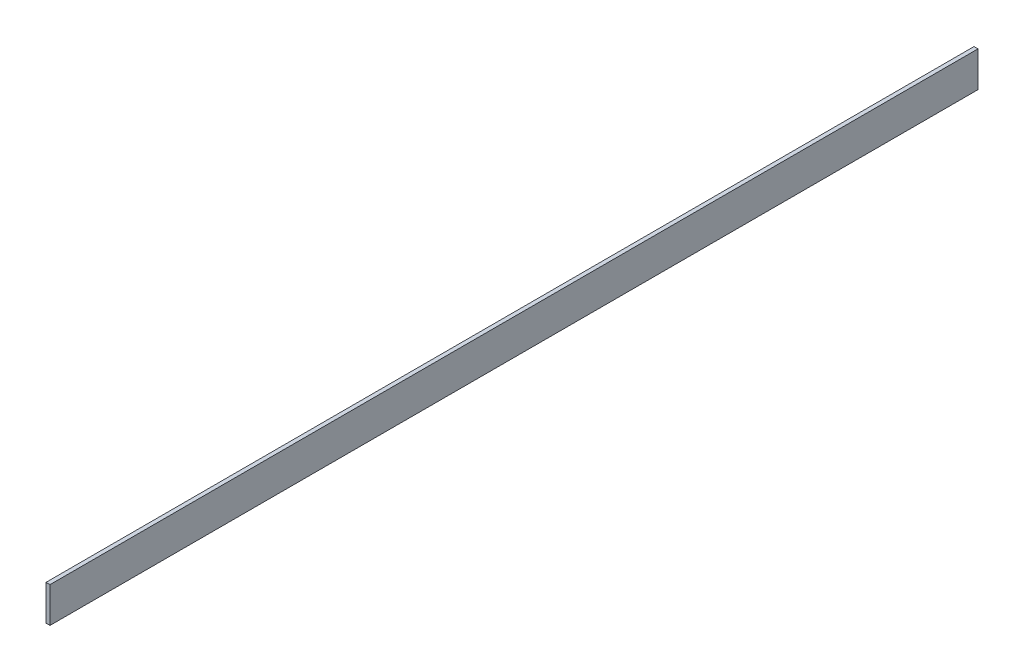
ISO-10303-21;
HEADER;
FILE_DESCRIPTION(('STEP AP214'),'2;1');
FILE_NAME('part.step','',(''),(''),'','','');
FILE_SCHEMA(('AUTOMOTIVE_DESIGN { 1 0 10303 214 1 1 1 1 }'));
ENDSEC;
DATA;
#1=APPLICATION_CONTEXT('core data for automotive mechanical design processes');
#2=APPLICATION_PROTOCOL_DEFINITION('international standard','automotive_design',2000,#1);
#3=PRODUCT_CONTEXT('',#1,'mechanical');
#4=PRODUCT('Part','Part','',(#3));
#5=PRODUCT_RELATED_PRODUCT_CATEGORY('part','',(#4));
#6=PRODUCT_DEFINITION_FORMATION('','',#4);
#7=PRODUCT_DEFINITION_CONTEXT('part definition',#1,'design');
#8=PRODUCT_DEFINITION('design','',#6,#7);
#9=PRODUCT_DEFINITION_SHAPE('','',#8);
#10=(LENGTH_UNIT() NAMED_UNIT(*) SI_UNIT(.MILLI.,.METRE.));
#11=(NAMED_UNIT(*) PLANE_ANGLE_UNIT() SI_UNIT($,.RADIAN.));
#12=(NAMED_UNIT(*) SI_UNIT($,.STERADIAN.) SOLID_ANGLE_UNIT());
#13=UNCERTAINTY_MEASURE_WITH_UNIT(LENGTH_MEASURE(1.E-05),#10,'distance_accuracy_value','');
#14=(GEOMETRIC_REPRESENTATION_CONTEXT(3) GLOBAL_UNCERTAINTY_ASSIGNED_CONTEXT((#13)) GLOBAL_UNIT_ASSIGNED_CONTEXT((#10,
#11,#12)) REPRESENTATION_CONTEXT('',''));
#15=CARTESIAN_POINT('',(0.,0.,0.));
#16=DIRECTION('',(0.,0.,1.));
#17=DIRECTION('',(1.,0.,0.));
#18=AXIS2_PLACEMENT_3D('',#15,#16,#17);
#19=CARTESIAN_POINT('',(-0.900000000000026,8.,-210.000000000001));
#20=DIRECTION('',(0.,0.,-1.));
#21=DIRECTION('',(-1.,0.,0.));
#22=AXIS2_PLACEMENT_3D('',#19,#20,#21);
#23=PLANE('',#22);
#24=DIRECTION('',(1.,0.,0.));
#25=VECTOR('',#24,1.);
#26=CARTESIAN_POINT('',(-0.900000000000026,-8.,-210.000000000001));
#27=LINE('',#26,#25);
#28=CARTESIAN_POINT('',(-0.900000000000026,-8.,-210.000000000001));
#29=VERTEX_POINT('',#28);
#30=CARTESIAN_POINT('',(0.899999999999974,-8.,-210.000000000001));
#31=VERTEX_POINT('',#30);
#32=EDGE_CURVE('E102',#29,#31,#27,.T.);
#33=ORIENTED_EDGE('',*,*,#32,.F.);
#34=DIRECTION('',(0.,-1.,0.));
#35=VECTOR('',#34,1.);
#36=CARTESIAN_POINT('',(-0.900000000000026,8.,-210.000000000001));
#37=LINE('',#36,#35);
#38=CARTESIAN_POINT('',(-0.900000000000026,8.,-210.000000000001));
#39=VERTEX_POINT('',#38);
#40=EDGE_CURVE('E11',#39,#29,#37,.T.);
#41=ORIENTED_EDGE('',*,*,#40,.F.);
#42=DIRECTION('',(1.,0.,0.));
#43=VECTOR('',#42,1.);
#44=CARTESIAN_POINT('',(-0.900000000000026,8.,-210.000000000001));
#45=LINE('',#44,#43);
#46=CARTESIAN_POINT('',(0.899999999999974,8.,-210.000000000001));
#47=VERTEX_POINT('',#46);
#48=EDGE_CURVE('E97',#39,#47,#45,.T.);
#49=ORIENTED_EDGE('',*,*,#48,.T.);
#50=DIRECTION('',(0.,-1.,0.));
#51=VECTOR('',#50,1.);
#52=CARTESIAN_POINT('',(0.899999999999974,8.,-210.000000000001));
#53=LINE('',#52,#51);
#54=EDGE_CURVE('E40',#47,#31,#53,.T.);
#55=ORIENTED_EDGE('',*,*,#54,.T.);
#56=EDGE_LOOP('',(#33,#41,#49,#55));
#57=FACE_BOUND('',#56,.T.);
#58=ADVANCED_FACE('F37',(#57),#23,.T.);
#59=CARTESIAN_POINT('',(-0.900000000000026,8.,-210.000000000001));
#60=DIRECTION('',(1.,0.,0.));
#61=DIRECTION('',(0.,0.,-1.));
#62=AXIS2_PLACEMENT_3D('',#59,#60,#61);
#63=PLANE('',#62);
#64=DIRECTION('',(0.,0.,1.));
#65=VECTOR('',#64,1.);
#66=CARTESIAN_POINT('',(-0.900000000000026,-8.,-210.000000000001));
#67=LINE('',#66,#65);
#68=CARTESIAN_POINT('',(-0.899999999999975,-8.,209.999999999998));
#69=VERTEX_POINT('',#68);
#70=EDGE_CURVE('E70',#29,#69,#67,.T.);
#71=ORIENTED_EDGE('',*,*,#70,.T.);
#72=DIRECTION('',(0.,-1.,0.));
#73=VECTOR('',#72,1.);
#74=CARTESIAN_POINT('',(-0.899999999999975,8.,209.999999999998));
#75=LINE('',#74,#73);
#76=CARTESIAN_POINT('',(-0.899999999999975,8.,209.999999999998));
#77=VERTEX_POINT('',#76);
#78=EDGE_CURVE('E46',#77,#69,#75,.T.);
#79=ORIENTED_EDGE('',*,*,#78,.F.);
#80=DIRECTION('',(0.,0.,1.));
#81=VECTOR('',#80,1.);
#82=CARTESIAN_POINT('',(-0.900000000000026,8.,-210.000000000001));
#83=LINE('',#82,#81);
#84=EDGE_CURVE('E87',#39,#77,#83,.T.);
#85=ORIENTED_EDGE('',*,*,#84,.F.);
#86=ORIENTED_EDGE('',*,*,#40,.T.);
#87=EDGE_LOOP('',(#71,#79,#85,#86));
#88=FACE_BOUND('',#87,.T.);
#89=ADVANCED_FACE('F112',(#88),#63,.F.);
#90=CARTESIAN_POINT('',(-0.899999999999975,8.,209.999999999998));
#91=DIRECTION('',(0.,0.,-1.));
#92=DIRECTION('',(-1.,0.,0.));
#93=AXIS2_PLACEMENT_3D('',#90,#91,#92);
#94=PLANE('',#93);
#95=DIRECTION('',(1.,0.,0.));
#96=VECTOR('',#95,1.);
#97=CARTESIAN_POINT('',(-0.899999999999975,-8.,209.999999999998));
#98=LINE('',#97,#96);
#99=CARTESIAN_POINT('',(0.900000000000025,-8.,209.999999999998));
#100=VERTEX_POINT('',#99);
#101=EDGE_CURVE('E94',#69,#100,#98,.T.);
#102=ORIENTED_EDGE('',*,*,#101,.T.);
#103=DIRECTION('',(0.,-1.,0.));
#104=VECTOR('',#103,1.);
#105=CARTESIAN_POINT('',(0.900000000000025,8.,209.999999999998));
#106=LINE('',#105,#104);
#107=CARTESIAN_POINT('',(0.900000000000025,8.,209.999999999998));
#108=VERTEX_POINT('',#107);
#109=EDGE_CURVE('E91',#108,#100,#106,.T.);
#110=ORIENTED_EDGE('',*,*,#109,.F.);
#111=DIRECTION('',(1.,0.,0.));
#112=VECTOR('',#111,1.);
#113=CARTESIAN_POINT('',(-0.899999999999975,8.,209.999999999998));
#114=LINE('',#113,#112);
#115=EDGE_CURVE('E82',#77,#108,#114,.T.);
#116=ORIENTED_EDGE('',*,*,#115,.F.);
#117=ORIENTED_EDGE('',*,*,#78,.T.);
#118=EDGE_LOOP('',(#102,#110,#116,#117));
#119=FACE_BOUND('',#118,.T.);
#120=ADVANCED_FACE('F92',(#119),#94,.F.);
#121=CARTESIAN_POINT('',(0.899999999999974,8.,-210.000000000001));
#122=DIRECTION('',(1.,0.,0.));
#123=DIRECTION('',(0.,0.,-1.));
#124=AXIS2_PLACEMENT_3D('',#121,#122,#123);
#125=PLANE('',#124);
#126=DIRECTION('',(0.,0.,1.));
#127=VECTOR('',#126,1.);
#128=CARTESIAN_POINT('',(0.899999999999974,-8.,-210.000000000001));
#129=LINE('',#128,#127);
#130=EDGE_CURVE('E105',#31,#100,#129,.T.);
#131=ORIENTED_EDGE('',*,*,#130,.F.);
#132=ORIENTED_EDGE('',*,*,#54,.F.);
#133=DIRECTION('',(0.,0.,1.));
#134=VECTOR('',#133,1.);
#135=CARTESIAN_POINT('',(0.899999999999974,8.,-210.000000000001));
#136=LINE('',#135,#134);
#137=EDGE_CURVE('E86',#47,#108,#136,.T.);
#138=ORIENTED_EDGE('',*,*,#137,.T.);
#139=ORIENTED_EDGE('',*,*,#109,.T.);
#140=EDGE_LOOP('',(#131,#132,#138,#139));
#141=FACE_BOUND('',#140,.T.);
#142=ADVANCED_FACE('F96',(#141),#125,.T.);
#143=CARTESIAN_POINT('',(0.,8.,0.));
#144=DIRECTION('',(0.,-1.,0.));
#145=DIRECTION('',(0.,0.,-1.));
#146=AXIS2_PLACEMENT_3D('',#143,#144,#145);
#147=PLANE('',#146);
#148=ORIENTED_EDGE('',*,*,#48,.F.);
#149=ORIENTED_EDGE('',*,*,#84,.T.);
#150=ORIENTED_EDGE('',*,*,#115,.T.);
#151=ORIENTED_EDGE('',*,*,#137,.F.);
#152=EDGE_LOOP('',(#148,#149,#150,#151));
#153=FACE_BOUND('',#152,.T.);
#154=ADVANCED_FACE('F85',(#153),#147,.F.);
#155=CARTESIAN_POINT('',(0.,-8.,0.));
#156=DIRECTION('',(0.,-1.,0.));
#157=DIRECTION('',(0.,0.,-1.));
#158=AXIS2_PLACEMENT_3D('',#155,#156,#157);
#159=PLANE('',#158);
#160=ORIENTED_EDGE('',*,*,#32,.T.);
#161=ORIENTED_EDGE('',*,*,#130,.T.);
#162=ORIENTED_EDGE('',*,*,#101,.F.);
#163=ORIENTED_EDGE('',*,*,#70,.F.);
#164=EDGE_LOOP('',(#160,#161,#162,#163));
#165=FACE_BOUND('',#164,.T.);
#166=ADVANCED_FACE('F110',(#165),#159,.T.);
#167=CLOSED_SHELL('',(#58,#89,#120,#142,#154,#166));
#168=MANIFOLD_SOLID_BREP('B2',#167);
#169=ADVANCED_BREP_SHAPE_REPRESENTATION('',(#18,#168),#14);
#170=SHAPE_DEFINITION_REPRESENTATION(#9,#169);
ENDSEC;
END-ISO-10303-21;
